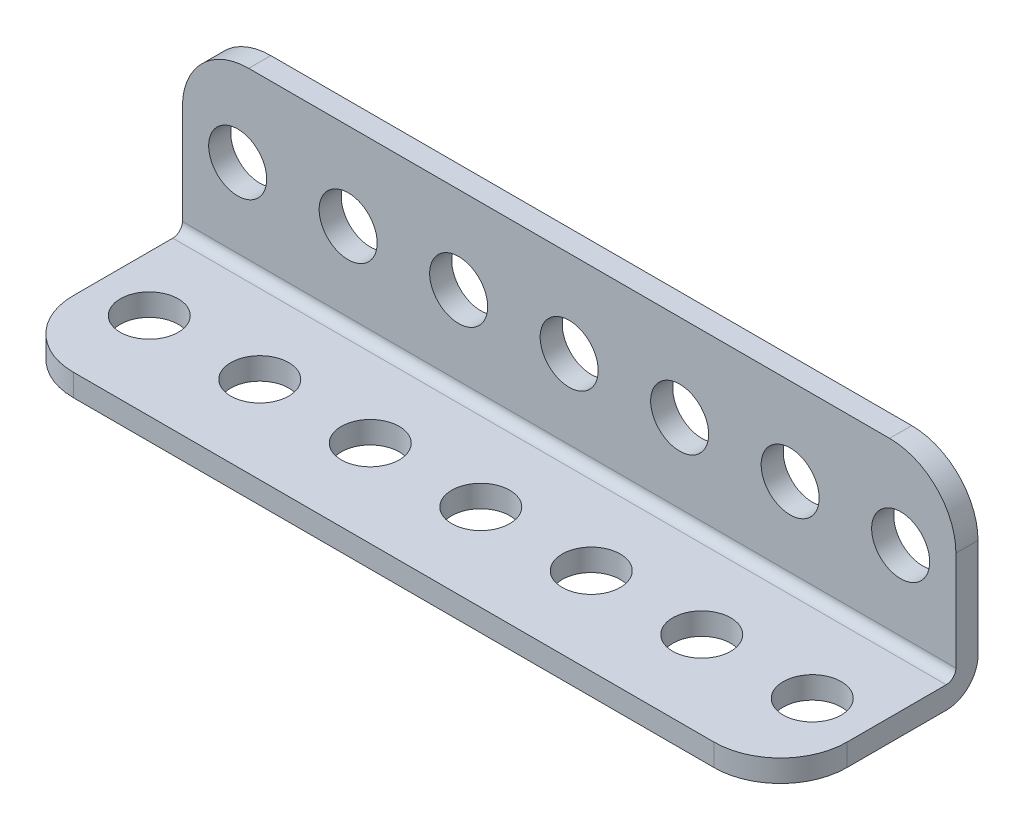
ISO-10303-21;
HEADER;
FILE_DESCRIPTION(('STEP AP214'),'2;1');
FILE_NAME('part.step','',(''),(''),'','','');
FILE_SCHEMA(('AUTOMOTIVE_DESIGN { 1 0 10303 214 1 1 1 1 }'));
ENDSEC;
DATA;
#1=APPLICATION_CONTEXT('core data for automotive mechanical design processes');
#2=APPLICATION_PROTOCOL_DEFINITION('international standard','automotive_design',2000,#1);
#3=PRODUCT_CONTEXT('',#1,'mechanical');
#4=PRODUCT('Part','Part','',(#3));
#5=PRODUCT_RELATED_PRODUCT_CATEGORY('part','',(#4));
#6=PRODUCT_DEFINITION_FORMATION('','',#4);
#7=PRODUCT_DEFINITION_CONTEXT('part definition',#1,'design');
#8=PRODUCT_DEFINITION('design','',#6,#7);
#9=PRODUCT_DEFINITION_SHAPE('','',#8);
#10=(LENGTH_UNIT() NAMED_UNIT(*) SI_UNIT(.MILLI.,.METRE.));
#11=(NAMED_UNIT(*) PLANE_ANGLE_UNIT() SI_UNIT($,.RADIAN.));
#12=(NAMED_UNIT(*) SI_UNIT($,.STERADIAN.) SOLID_ANGLE_UNIT());
#13=UNCERTAINTY_MEASURE_WITH_UNIT(LENGTH_MEASURE(1.E-05),#10,'distance_accuracy_value','');
#14=(GEOMETRIC_REPRESENTATION_CONTEXT(3) GLOBAL_UNCERTAINTY_ASSIGNED_CONTEXT((#13)) GLOBAL_UNIT_ASSIGNED_CONTEXT((#10,
#11,#12)) REPRESENTATION_CONTEXT('',''));
#15=CARTESIAN_POINT('',(0.,0.,0.));
#16=DIRECTION('',(0.,0.,1.));
#17=DIRECTION('',(1.,0.,0.));
#18=AXIS2_PLACEMENT_3D('',#15,#16,#17);
#19=CARTESIAN_POINT('',(51.2,7.9,-14.3));
#20=DIRECTION('',(0.,0.,1.));
#21=DIRECTION('',(0.,-1.,0.));
#22=AXIS2_PLACEMENT_3D('',#19,#20,#21);
#23=CYLINDRICAL_SURFACE('',#22,4.8);
#24=CARTESIAN_POINT('',(51.2,7.9,-14.3));
#25=DIRECTION('',(0.,0.,1.));
#26=DIRECTION('',(0.,-1.,0.));
#27=AXIS2_PLACEMENT_3D('',#24,#25,#26);
#28=CIRCLE('',#27,4.8);
#29=CARTESIAN_POINT('',(56.,7.9,-14.3));
#30=VERTEX_POINT('',#29);
#31=CARTESIAN_POINT('',(51.2,12.7,-14.3));
#32=VERTEX_POINT('',#31);
#33=EDGE_CURVE('E19',#30,#32,#28,.T.);
#34=ORIENTED_EDGE('',*,*,#33,.T.);
#35=DIRECTION('',(0.,0.,-1.));
#36=VECTOR('',#35,1.);
#37=CARTESIAN_POINT('',(51.2,12.7,-14.3));
#38=LINE('',#37,#36);
#39=CARTESIAN_POINT('',(51.2,12.7,-12.7));
#40=VERTEX_POINT('',#39);
#41=EDGE_CURVE('E109',#32,#40,#38,.F.);
#42=ORIENTED_EDGE('',*,*,#41,.T.);
#43=CARTESIAN_POINT('',(51.2,7.90000000000001,-12.7));
#44=DIRECTION('',(0.,0.,1.));
#45=DIRECTION('',(0.,-1.,0.));
#46=AXIS2_PLACEMENT_3D('',#43,#44,#45);
#47=CIRCLE('',#46,4.8);
#48=CARTESIAN_POINT('',(56.,7.90000000000001,-12.7));
#49=VERTEX_POINT('',#48);
#50=EDGE_CURVE('E105',#49,#40,#47,.T.);
#51=ORIENTED_EDGE('',*,*,#50,.F.);
#52=DIRECTION('',(0.,0.,1.));
#53=VECTOR('',#52,1.);
#54=CARTESIAN_POINT('',(56.,7.9,-14.3));
#55=LINE('',#54,#53);
#56=EDGE_CURVE('E102',#49,#30,#55,.F.);
#57=ORIENTED_EDGE('',*,*,#56,.T.);
#58=EDGE_LOOP('',(#34,#42,#51,#57));
#59=FACE_BOUND('',#58,.T.);
#60=ADVANCED_FACE('F16',(#59),#23,.T.);
#61=CARTESIAN_POINT('',(56.,12.7,-14.3));
#62=DIRECTION('',(0.,-1.,0.));
#63=DIRECTION('',(0.,0.,-1.));
#64=AXIS2_PLACEMENT_3D('',#61,#62,#63);
#65=PLANE('',#64);
#66=DIRECTION('',(1.,0.,0.));
#67=VECTOR('',#66,1.);
#68=CARTESIAN_POINT('',(0.,12.7,-12.7));
#69=LINE('',#68,#67);
#70=CARTESIAN_POINT('',(4.8,12.7,-12.7));
#71=VERTEX_POINT('',#70);
#72=EDGE_CURVE('E158',#40,#71,#69,.F.);
#73=ORIENTED_EDGE('',*,*,#72,.F.);
#74=ORIENTED_EDGE('',*,*,#41,.F.);
#75=DIRECTION('',(1.,0.,0.));
#76=VECTOR('',#75,1.);
#77=CARTESIAN_POINT('',(0.,12.7,-14.3));
#78=LINE('',#77,#76);
#79=CARTESIAN_POINT('',(4.8,12.7,-14.3));
#80=VERTEX_POINT('',#79);
#81=EDGE_CURVE('E118',#32,#80,#78,.F.);
#82=ORIENTED_EDGE('',*,*,#81,.T.);
#83=DIRECTION('',(0.,0.,1.));
#84=VECTOR('',#83,1.);
#85=CARTESIAN_POINT('',(4.8,12.7,-14.3));
#86=LINE('',#85,#84);
#87=EDGE_CURVE('E168',#71,#80,#86,.F.);
#88=ORIENTED_EDGE('',*,*,#87,.F.);
#89=EDGE_LOOP('',(#73,#74,#82,#88));
#90=FACE_BOUND('',#89,.T.);
#91=ADVANCED_FACE('F316',(#90),#65,.F.);
#92=CARTESIAN_POINT('',(4.8,7.9,-14.3));
#93=DIRECTION('',(0.,0.,1.));
#94=DIRECTION('',(0.,-1.,0.));
#95=AXIS2_PLACEMENT_3D('',#92,#93,#94);
#96=CYLINDRICAL_SURFACE('',#95,4.8);
#97=CARTESIAN_POINT('',(4.8,7.9,-14.3));
#98=DIRECTION('',(0.,0.,1.));
#99=DIRECTION('',(0.,-1.,0.));
#100=AXIS2_PLACEMENT_3D('',#97,#98,#99);
#101=CIRCLE('',#100,4.8);
#102=CARTESIAN_POINT('',(0.,7.9,-14.3));
#103=VERTEX_POINT('',#102);
#104=EDGE_CURVE('E162',#80,#103,#101,.T.);
#105=ORIENTED_EDGE('',*,*,#104,.T.);
#106=DIRECTION('',(0.,0.,1.));
#107=VECTOR('',#106,1.);
#108=CARTESIAN_POINT('',(0.,7.9,-14.3));
#109=LINE('',#108,#107);
#110=CARTESIAN_POINT('',(0.,7.90000000000001,-12.7));
#111=VERTEX_POINT('',#110);
#112=EDGE_CURVE('E164',#103,#111,#109,.T.);
#113=ORIENTED_EDGE('',*,*,#112,.T.);
#114=CARTESIAN_POINT('',(4.8,7.90000000000001,-12.7));
#115=DIRECTION('',(0.,0.,1.));
#116=DIRECTION('',(0.,-1.,0.));
#117=AXIS2_PLACEMENT_3D('',#114,#115,#116);
#118=CIRCLE('',#117,4.8);
#119=EDGE_CURVE('E160',#71,#111,#118,.T.);
#120=ORIENTED_EDGE('',*,*,#119,.F.);
#121=ORIENTED_EDGE('',*,*,#87,.T.);
#122=EDGE_LOOP('',(#105,#113,#120,#121));
#123=FACE_BOUND('',#122,.T.);
#124=ADVANCED_FACE('F270',(#123),#96,.T.);
#125=CARTESIAN_POINT('',(4.,6.4,-22.7));
#126=DIRECTION('',(0.,0.,1.));
#127=DIRECTION('',(1.,0.,0.));
#128=AXIS2_PLACEMENT_3D('',#125,#126,#127);
#129=CYLINDRICAL_SURFACE('',#128,2.1);
#130=CARTESIAN_POINT('',(4.,6.4,-14.3));
#131=DIRECTION('',(0.,0.,1.));
#132=DIRECTION('',(1.,0.,0.));
#133=AXIS2_PLACEMENT_3D('',#130,#131,#132);
#134=CIRCLE('',#133,2.1);
#135=CARTESIAN_POINT('',(6.1,6.4,-14.3));
#136=VERTEX_POINT('',#135);
#137=EDGE_CURVE('E265',#136,#136,#134,.F.);
#138=ORIENTED_EDGE('',*,*,#137,.T.);
#139=EDGE_LOOP('',(#138));
#140=FACE_BOUND('',#139,.T.);
#141=CARTESIAN_POINT('',(4.,6.4,-12.7));
#142=DIRECTION('',(0.,0.,1.));
#143=DIRECTION('',(1.,0.,0.));
#144=AXIS2_PLACEMENT_3D('',#141,#142,#143);
#145=CIRCLE('',#144,2.1);
#146=CARTESIAN_POINT('',(6.1,6.4,-12.7));
#147=VERTEX_POINT('',#146);
#148=EDGE_CURVE('E241',#147,#147,#145,.F.);
#149=ORIENTED_EDGE('',*,*,#148,.F.);
#150=EDGE_LOOP('',(#149));
#151=FACE_BOUND('',#150,.T.);
#152=ADVANCED_FACE('F323',(#140,#151),#129,.F.);
#153=CARTESIAN_POINT('',(12.,6.4,-22.7));
#154=DIRECTION('',(0.,0.,1.));
#155=DIRECTION('',(1.,0.,0.));
#156=AXIS2_PLACEMENT_3D('',#153,#154,#155);
#157=CYLINDRICAL_SURFACE('',#156,2.1);
#158=CARTESIAN_POINT('',(12.,6.4,-14.3));
#159=DIRECTION('',(0.,0.,1.));
#160=DIRECTION('',(1.,0.,0.));
#161=AXIS2_PLACEMENT_3D('',#158,#159,#160);
#162=CIRCLE('',#161,2.1);
#163=CARTESIAN_POINT('',(14.1,6.4,-14.3));
#164=VERTEX_POINT('',#163);
#165=EDGE_CURVE('E262',#164,#164,#162,.F.);
#166=ORIENTED_EDGE('',*,*,#165,.T.);
#167=EDGE_LOOP('',(#166));
#168=FACE_BOUND('',#167,.T.);
#169=CARTESIAN_POINT('',(12.,6.4,-12.7));
#170=DIRECTION('',(0.,0.,1.));
#171=DIRECTION('',(1.,0.,0.));
#172=AXIS2_PLACEMENT_3D('',#169,#170,#171);
#173=CIRCLE('',#172,2.1);
#174=CARTESIAN_POINT('',(14.1,6.4,-12.7));
#175=VERTEX_POINT('',#174);
#176=EDGE_CURVE('E238',#175,#175,#173,.F.);
#177=ORIENTED_EDGE('',*,*,#176,.F.);
#178=EDGE_LOOP('',(#177));
#179=FACE_BOUND('',#178,.T.);
#180=ADVANCED_FACE('F405',(#168,#179),#157,.F.);
#181=CARTESIAN_POINT('',(52.,6.4,-22.7));
#182=DIRECTION('',(0.,0.,1.));
#183=DIRECTION('',(1.,0.,0.));
#184=AXIS2_PLACEMENT_3D('',#181,#182,#183);
#185=CYLINDRICAL_SURFACE('',#184,2.1);
#186=CARTESIAN_POINT('',(52.,6.4,-14.3));
#187=DIRECTION('',(0.,0.,1.));
#188=DIRECTION('',(1.,0.,0.));
#189=AXIS2_PLACEMENT_3D('',#186,#187,#188);
#190=CIRCLE('',#189,2.1);
#191=CARTESIAN_POINT('',(54.1,6.4,-14.3));
#192=VERTEX_POINT('',#191);
#193=EDGE_CURVE('E259',#192,#192,#190,.F.);
#194=ORIENTED_EDGE('',*,*,#193,.T.);
#195=EDGE_LOOP('',(#194));
#196=FACE_BOUND('',#195,.T.);
#197=CARTESIAN_POINT('',(52.,6.4,-12.7));
#198=DIRECTION('',(0.,0.,1.));
#199=DIRECTION('',(1.,0.,0.));
#200=AXIS2_PLACEMENT_3D('',#197,#198,#199);
#201=CIRCLE('',#200,2.1);
#202=CARTESIAN_POINT('',(54.1,6.4,-12.7));
#203=VERTEX_POINT('',#202);
#204=EDGE_CURVE('E235',#203,#203,#201,.F.);
#205=ORIENTED_EDGE('',*,*,#204,.F.);
#206=EDGE_LOOP('',(#205));
#207=FACE_BOUND('',#206,.T.);
#208=ADVANCED_FACE('F401',(#196,#207),#185,.F.);
#209=CARTESIAN_POINT('',(44.,6.4,-22.7));
#210=DIRECTION('',(0.,0.,1.));
#211=DIRECTION('',(1.,0.,0.));
#212=AXIS2_PLACEMENT_3D('',#209,#210,#211);
#213=CYLINDRICAL_SURFACE('',#212,2.1);
#214=CARTESIAN_POINT('',(44.,6.4,-14.3));
#215=DIRECTION('',(0.,0.,1.));
#216=DIRECTION('',(1.,0.,0.));
#217=AXIS2_PLACEMENT_3D('',#214,#215,#216);
#218=CIRCLE('',#217,2.1);
#219=CARTESIAN_POINT('',(46.1,6.4,-14.3));
#220=VERTEX_POINT('',#219);
#221=EDGE_CURVE('E256',#220,#220,#218,.F.);
#222=ORIENTED_EDGE('',*,*,#221,.T.);
#223=EDGE_LOOP('',(#222));
#224=FACE_BOUND('',#223,.T.);
#225=CARTESIAN_POINT('',(44.,6.4,-12.7));
#226=DIRECTION('',(0.,0.,1.));
#227=DIRECTION('',(1.,0.,0.));
#228=AXIS2_PLACEMENT_3D('',#225,#226,#227);
#229=CIRCLE('',#228,2.1);
#230=CARTESIAN_POINT('',(46.1,6.4,-12.7));
#231=VERTEX_POINT('',#230);
#232=EDGE_CURVE('E232',#231,#231,#229,.F.);
#233=ORIENTED_EDGE('',*,*,#232,.F.);
#234=EDGE_LOOP('',(#233));
#235=FACE_BOUND('',#234,.T.);
#236=ADVANCED_FACE('F397',(#224,#235),#213,.F.);
#237=CARTESIAN_POINT('',(36.,6.4,-22.7));
#238=DIRECTION('',(0.,0.,1.));
#239=DIRECTION('',(1.,0.,0.));
#240=AXIS2_PLACEMENT_3D('',#237,#238,#239);
#241=CYLINDRICAL_SURFACE('',#240,2.1);
#242=CARTESIAN_POINT('',(36.,6.4,-14.3));
#243=DIRECTION('',(0.,0.,1.));
#244=DIRECTION('',(1.,0.,0.));
#245=AXIS2_PLACEMENT_3D('',#242,#243,#244);
#246=CIRCLE('',#245,2.1);
#247=CARTESIAN_POINT('',(38.1,6.4,-14.3));
#248=VERTEX_POINT('',#247);
#249=EDGE_CURVE('E253',#248,#248,#246,.F.);
#250=ORIENTED_EDGE('',*,*,#249,.T.);
#251=EDGE_LOOP('',(#250));
#252=FACE_BOUND('',#251,.T.);
#253=CARTESIAN_POINT('',(36.,6.4,-12.7));
#254=DIRECTION('',(0.,0.,1.));
#255=DIRECTION('',(1.,0.,0.));
#256=AXIS2_PLACEMENT_3D('',#253,#254,#255);
#257=CIRCLE('',#256,2.1);
#258=CARTESIAN_POINT('',(38.1,6.4,-12.7));
#259=VERTEX_POINT('',#258);
#260=EDGE_CURVE('E229',#259,#259,#257,.F.);
#261=ORIENTED_EDGE('',*,*,#260,.F.);
#262=EDGE_LOOP('',(#261));
#263=FACE_BOUND('',#262,.T.);
#264=ADVANCED_FACE('F393',(#252,#263),#241,.F.);
#265=CARTESIAN_POINT('',(28.,6.4,-22.7));
#266=DIRECTION('',(0.,0.,1.));
#267=DIRECTION('',(1.,0.,0.));
#268=AXIS2_PLACEMENT_3D('',#265,#266,#267);
#269=CYLINDRICAL_SURFACE('',#268,2.1);
#270=CARTESIAN_POINT('',(28.,6.4,-14.3));
#271=DIRECTION('',(0.,0.,1.));
#272=DIRECTION('',(1.,0.,0.));
#273=AXIS2_PLACEMENT_3D('',#270,#271,#272);
#274=CIRCLE('',#273,2.1);
#275=CARTESIAN_POINT('',(30.1,6.4,-14.3));
#276=VERTEX_POINT('',#275);
#277=EDGE_CURVE('E250',#276,#276,#274,.F.);
#278=ORIENTED_EDGE('',*,*,#277,.T.);
#279=EDGE_LOOP('',(#278));
#280=FACE_BOUND('',#279,.T.);
#281=CARTESIAN_POINT('',(28.,6.4,-12.7));
#282=DIRECTION('',(0.,0.,1.));
#283=DIRECTION('',(1.,0.,0.));
#284=AXIS2_PLACEMENT_3D('',#281,#282,#283);
#285=CIRCLE('',#284,2.1);
#286=CARTESIAN_POINT('',(30.1,6.4,-12.7));
#287=VERTEX_POINT('',#286);
#288=EDGE_CURVE('E226',#287,#287,#285,.F.);
#289=ORIENTED_EDGE('',*,*,#288,.F.);
#290=EDGE_LOOP('',(#289));
#291=FACE_BOUND('',#290,.T.);
#292=ADVANCED_FACE('F389',(#280,#291),#269,.F.);
#293=CARTESIAN_POINT('',(20.,6.4,-22.7));
#294=DIRECTION('',(0.,0.,1.));
#295=DIRECTION('',(1.,0.,0.));
#296=AXIS2_PLACEMENT_3D('',#293,#294,#295);
#297=CYLINDRICAL_SURFACE('',#296,2.1);
#298=CARTESIAN_POINT('',(20.,6.4,-14.3));
#299=DIRECTION('',(0.,0.,1.));
#300=DIRECTION('',(1.,0.,0.));
#301=AXIS2_PLACEMENT_3D('',#298,#299,#300);
#302=CIRCLE('',#301,2.1);
#303=CARTESIAN_POINT('',(22.1,6.4,-14.3));
#304=VERTEX_POINT('',#303);
#305=EDGE_CURVE('E247',#304,#304,#302,.F.);
#306=ORIENTED_EDGE('',*,*,#305,.T.);
#307=EDGE_LOOP('',(#306));
#308=FACE_BOUND('',#307,.T.);
#309=CARTESIAN_POINT('',(20.,6.4,-12.7));
#310=DIRECTION('',(0.,0.,1.));
#311=DIRECTION('',(1.,0.,0.));
#312=AXIS2_PLACEMENT_3D('',#309,#310,#311);
#313=CIRCLE('',#312,2.1);
#314=CARTESIAN_POINT('',(22.1,6.4,-12.7));
#315=VERTEX_POINT('',#314);
#316=EDGE_CURVE('E166',#315,#315,#313,.F.);
#317=ORIENTED_EDGE('',*,*,#316,.F.);
#318=EDGE_LOOP('',(#317));
#319=FACE_BOUND('',#318,.T.);
#320=ADVANCED_FACE('F386',(#308,#319),#297,.F.);
#321=CARTESIAN_POINT('',(0.,0.699999999999995,-12.));
#322=DIRECTION('',(-1.,0.,0.));
#323=DIRECTION('',(0.,0.,1.));
#324=AXIS2_PLACEMENT_3D('',#321,#322,#323);
#325=CYLINDRICAL_SURFACE('',#324,2.3);
#326=DIRECTION('',(1.,0.,0.));
#327=VECTOR('',#326,1.);
#328=CARTESIAN_POINT('',(0.,-1.6,-12.));
#329=LINE('',#328,#327);
#330=CARTESIAN_POINT('',(0.,-1.6,-12.));
#331=VERTEX_POINT('',#330);
#332=CARTESIAN_POINT('',(56.,-1.6,-12.));
#333=VERTEX_POINT('',#332);
#334=EDGE_CURVE('E151',#331,#333,#329,.T.);
#335=ORIENTED_EDGE('',*,*,#334,.F.);
#336=CARTESIAN_POINT('',(0.,0.699999999999995,-12.));
#337=DIRECTION('',(-1.,0.,0.));
#338=DIRECTION('',(0.,0.,1.));
#339=AXIS2_PLACEMENT_3D('',#336,#337,#338);
#340=CIRCLE('',#339,2.3);
#341=CARTESIAN_POINT('',(0.,0.699999999999998,-14.3));
#342=VERTEX_POINT('',#341);
#343=EDGE_CURVE('E144',#342,#331,#340,.T.);
#344=ORIENTED_EDGE('',*,*,#343,.F.);
#345=DIRECTION('',(1.,0.,0.));
#346=VECTOR('',#345,1.);
#347=CARTESIAN_POINT('',(0.,0.700000000000002,-14.3));
#348=LINE('',#347,#346);
#349=CARTESIAN_POINT('',(56.,0.699999999999998,-14.3));
#350=VERTEX_POINT('',#349);
#351=EDGE_CURVE('E119',#342,#350,#348,.T.);
#352=ORIENTED_EDGE('',*,*,#351,.T.);
#353=CARTESIAN_POINT('',(56.,0.699999999999995,-12.));
#354=DIRECTION('',(-1.,0.,0.));
#355=DIRECTION('',(0.,0.,1.));
#356=AXIS2_PLACEMENT_3D('',#353,#354,#355);
#357=CIRCLE('',#356,2.3);
#358=EDGE_CURVE('E124',#333,#350,#357,.F.);
#359=ORIENTED_EDGE('',*,*,#358,.F.);
#360=EDGE_LOOP('',(#335,#344,#352,#359));
#361=FACE_BOUND('',#360,.T.);
#362=ADVANCED_FACE('F278',(#361),#325,.T.);
#363=CARTESIAN_POINT('',(0.,0.,-14.3));
#364=DIRECTION('',(0.,0.,1.));
#365=DIRECTION('',(0.,-1.,0.));
#366=AXIS2_PLACEMENT_3D('',#363,#364,#365);
#367=PLANE('',#366);
#368=ORIENTED_EDGE('',*,*,#305,.F.);
#369=EDGE_LOOP('',(#368));
#370=FACE_BOUND('',#369,.T.);
#371=ORIENTED_EDGE('',*,*,#277,.F.);
#372=EDGE_LOOP('',(#371));
#373=FACE_BOUND('',#372,.T.);
#374=ORIENTED_EDGE('',*,*,#249,.F.);
#375=EDGE_LOOP('',(#374));
#376=FACE_BOUND('',#375,.T.);
#377=ORIENTED_EDGE('',*,*,#221,.F.);
#378=EDGE_LOOP('',(#377));
#379=FACE_BOUND('',#378,.T.);
#380=ORIENTED_EDGE('',*,*,#193,.F.);
#381=EDGE_LOOP('',(#380));
#382=FACE_BOUND('',#381,.T.);
#383=ORIENTED_EDGE('',*,*,#165,.F.);
#384=EDGE_LOOP('',(#383));
#385=FACE_BOUND('',#384,.T.);
#386=ORIENTED_EDGE('',*,*,#137,.F.);
#387=EDGE_LOOP('',(#386));
#388=FACE_BOUND('',#387,.T.);
#389=ORIENTED_EDGE('',*,*,#81,.F.);
#390=ORIENTED_EDGE('',*,*,#33,.F.);
#391=DIRECTION('',(0.,1.,0.));
#392=VECTOR('',#391,1.);
#393=CARTESIAN_POINT('',(56.,-1.6,-14.3));
#394=LINE('',#393,#392);
#395=EDGE_CURVE('E115',#350,#30,#394,.T.);
#396=ORIENTED_EDGE('',*,*,#395,.F.);
#397=ORIENTED_EDGE('',*,*,#351,.F.);
#398=DIRECTION('',(0.,1.,0.));
#399=VECTOR('',#398,1.);
#400=CARTESIAN_POINT('',(0.,-1.6,-14.3));
#401=LINE('',#400,#399);
#402=EDGE_CURVE('E145',#103,#342,#401,.F.);
#403=ORIENTED_EDGE('',*,*,#402,.F.);
#404=ORIENTED_EDGE('',*,*,#104,.F.);
#405=EDGE_LOOP('',(#389,#390,#396,#397,#403,#404));
#406=FACE_BOUND('',#405,.T.);
#407=ADVANCED_FACE('F114',(#370,#373,#376,#379,#382,#385,#388,#406),#367,.F.);
#408=CARTESIAN_POINT('',(0.,0.,-12.7));
#409=DIRECTION('',(0.,0.,1.));
#410=DIRECTION('',(0.,-1.,0.));
#411=AXIS2_PLACEMENT_3D('',#408,#409,#410);
#412=PLANE('',#411);
#413=ORIENTED_EDGE('',*,*,#316,.T.);
#414=EDGE_LOOP('',(#413));
#415=FACE_BOUND('',#414,.T.);
#416=ORIENTED_EDGE('',*,*,#288,.T.);
#417=EDGE_LOOP('',(#416));
#418=FACE_BOUND('',#417,.T.);
#419=ORIENTED_EDGE('',*,*,#260,.T.);
#420=EDGE_LOOP('',(#419));
#421=FACE_BOUND('',#420,.T.);
#422=ORIENTED_EDGE('',*,*,#232,.T.);
#423=EDGE_LOOP('',(#422));
#424=FACE_BOUND('',#423,.T.);
#425=ORIENTED_EDGE('',*,*,#204,.T.);
#426=EDGE_LOOP('',(#425));
#427=FACE_BOUND('',#426,.T.);
#428=ORIENTED_EDGE('',*,*,#176,.T.);
#429=EDGE_LOOP('',(#428));
#430=FACE_BOUND('',#429,.T.);
#431=ORIENTED_EDGE('',*,*,#148,.T.);
#432=EDGE_LOOP('',(#431));
#433=FACE_BOUND('',#432,.T.);
#434=DIRECTION('',(0.,1.,0.));
#435=VECTOR('',#434,1.);
#436=CARTESIAN_POINT('',(0.,-1.6,-12.7));
#437=LINE('',#436,#435);
#438=CARTESIAN_POINT('',(0.,0.699999999999993,-12.7));
#439=VERTEX_POINT('',#438);
#440=EDGE_CURVE('E148',#439,#111,#437,.T.);
#441=ORIENTED_EDGE('',*,*,#440,.F.);
#442=DIRECTION('',(-1.,0.,0.));
#443=VECTOR('',#442,1.);
#444=CARTESIAN_POINT('',(0.,0.699999999999992,-12.7));
#445=LINE('',#444,#443);
#446=CARTESIAN_POINT('',(56.,0.699999999999993,-12.7));
#447=VERTEX_POINT('',#446);
#448=EDGE_CURVE('E135',#439,#447,#445,.F.);
#449=ORIENTED_EDGE('',*,*,#448,.T.);
#450=DIRECTION('',(0.,1.,0.));
#451=VECTOR('',#450,1.);
#452=CARTESIAN_POINT('',(56.,-1.6,-12.7));
#453=LINE('',#452,#451);
#454=EDGE_CURVE('E126',#49,#447,#453,.F.);
#455=ORIENTED_EDGE('',*,*,#454,.F.);
#456=ORIENTED_EDGE('',*,*,#50,.T.);
#457=ORIENTED_EDGE('',*,*,#72,.T.);
#458=ORIENTED_EDGE('',*,*,#119,.T.);
#459=EDGE_LOOP('',(#441,#449,#455,#456,#457,#458));
#460=FACE_BOUND('',#459,.T.);
#461=ADVANCED_FACE('F312',(#415,#418,#421,#424,#427,#430,#433,#460),#412,.T.);
#462=CARTESIAN_POINT('',(0.,-1.6,0.));
#463=DIRECTION('',(0.,-1.,0.));
#464=DIRECTION('',(0.,0.,-1.));
#465=AXIS2_PLACEMENT_3D('',#462,#463,#464);
#466=PLANE('',#465);
#467=CARTESIAN_POINT('',(20.,-1.6,-6.30000000000005));
#468=DIRECTION('',(0.,1.,0.));
#469=DIRECTION('',(0.,0.,1.));
#470=AXIS2_PLACEMENT_3D('',#467,#468,#469);
#471=CIRCLE('',#470,2.1);
#472=CARTESIAN_POINT('',(20.,-1.6,-4.20000000000005));
#473=VERTEX_POINT('',#472);
#474=EDGE_CURVE('E194',#473,#473,#471,.T.);
#475=ORIENTED_EDGE('',*,*,#474,.T.);
#476=EDGE_LOOP('',(#475));
#477=FACE_BOUND('',#476,.T.);
#478=CARTESIAN_POINT('',(28.,-1.6,-6.30000000000005));
#479=DIRECTION('',(0.,1.,0.));
#480=DIRECTION('',(0.,0.,1.));
#481=AXIS2_PLACEMENT_3D('',#478,#479,#480);
#482=CIRCLE('',#481,2.1);
#483=CARTESIAN_POINT('',(28.,-1.6,-4.20000000000005));
#484=VERTEX_POINT('',#483);
#485=EDGE_CURVE('E197',#484,#484,#482,.T.);
#486=ORIENTED_EDGE('',*,*,#485,.T.);
#487=EDGE_LOOP('',(#486));
#488=FACE_BOUND('',#487,.T.);
#489=CARTESIAN_POINT('',(36.,-1.6,-6.30000000000005));
#490=DIRECTION('',(0.,1.,0.));
#491=DIRECTION('',(0.,0.,1.));
#492=AXIS2_PLACEMENT_3D('',#489,#490,#491);
#493=CIRCLE('',#492,2.1);
#494=CARTESIAN_POINT('',(36.,-1.6,-4.20000000000005));
#495=VERTEX_POINT('',#494);
#496=EDGE_CURVE('E200',#495,#495,#493,.T.);
#497=ORIENTED_EDGE('',*,*,#496,.T.);
#498=EDGE_LOOP('',(#497));
#499=FACE_BOUND('',#498,.T.);
#500=CARTESIAN_POINT('',(44.,-1.6,-6.30000000000005));
#501=DIRECTION('',(0.,1.,0.));
#502=DIRECTION('',(0.,0.,1.));
#503=AXIS2_PLACEMENT_3D('',#500,#501,#502);
#504=CIRCLE('',#503,2.1);
#505=CARTESIAN_POINT('',(44.,-1.6,-4.20000000000005));
#506=VERTEX_POINT('',#505);
#507=EDGE_CURVE('E203',#506,#506,#504,.T.);
#508=ORIENTED_EDGE('',*,*,#507,.T.);
#509=EDGE_LOOP('',(#508));
#510=FACE_BOUND('',#509,.T.);
#511=CARTESIAN_POINT('',(52.,-1.6,-6.30000000000005));
#512=DIRECTION('',(0.,1.,0.));
#513=DIRECTION('',(0.,0.,1.));
#514=AXIS2_PLACEMENT_3D('',#511,#512,#513);
#515=CIRCLE('',#514,2.1);
#516=CARTESIAN_POINT('',(52.,-1.6,-4.20000000000005));
#517=VERTEX_POINT('',#516);
#518=EDGE_CURVE('E206',#517,#517,#515,.T.);
#519=ORIENTED_EDGE('',*,*,#518,.T.);
#520=EDGE_LOOP('',(#519));
#521=FACE_BOUND('',#520,.T.);
#522=CARTESIAN_POINT('',(12.,-1.6,-6.30000000000005));
#523=DIRECTION('',(0.,1.,0.));
#524=DIRECTION('',(0.,0.,1.));
#525=AXIS2_PLACEMENT_3D('',#522,#523,#524);
#526=CIRCLE('',#525,2.1);
#527=CARTESIAN_POINT('',(12.,-1.6,-4.20000000000005));
#528=VERTEX_POINT('',#527);
#529=EDGE_CURVE('E209',#528,#528,#526,.T.);
#530=ORIENTED_EDGE('',*,*,#529,.T.);
#531=EDGE_LOOP('',(#530));
#532=FACE_BOUND('',#531,.T.);
#533=CARTESIAN_POINT('',(4.,-1.6,-6.30000000000005));
#534=DIRECTION('',(0.,1.,0.));
#535=DIRECTION('',(0.,0.,1.));
#536=AXIS2_PLACEMENT_3D('',#533,#534,#535);
#537=CIRCLE('',#536,2.1);
#538=CARTESIAN_POINT('',(4.,-1.6,-4.20000000000005));
#539=VERTEX_POINT('',#538);
#540=EDGE_CURVE('E212',#539,#539,#537,.T.);
#541=ORIENTED_EDGE('',*,*,#540,.T.);
#542=EDGE_LOOP('',(#541));
#543=FACE_BOUND('',#542,.T.);
#544=DIRECTION('',(0.,0.,1.));
#545=VECTOR('',#544,1.);
#546=CARTESIAN_POINT('',(0.,-1.6,0.));
#547=LINE('',#546,#545);
#548=CARTESIAN_POINT('',(0.,-1.6,-4.8));
#549=VERTEX_POINT('',#548);
#550=EDGE_CURVE('E141',#331,#549,#547,.T.);
#551=ORIENTED_EDGE('',*,*,#550,.F.);
#552=ORIENTED_EDGE('',*,*,#334,.T.);
#553=DIRECTION('',(0.,0.,-1.));
#554=VECTOR('',#553,1.);
#555=CARTESIAN_POINT('',(56.,-1.6,0.));
#556=LINE('',#555,#554);
#557=CARTESIAN_POINT('',(56.,-1.6,-4.8));
#558=VERTEX_POINT('',#557);
#559=EDGE_CURVE('E130',#558,#333,#556,.T.);
#560=ORIENTED_EDGE('',*,*,#559,.F.);
#561=CARTESIAN_POINT('',(51.2,-1.6,-4.8));
#562=DIRECTION('',(0.,1.,0.));
#563=DIRECTION('',(0.,0.,1.));
#564=AXIS2_PLACEMENT_3D('',#561,#562,#563);
#565=CIRCLE('',#564,4.8);
#566=CARTESIAN_POINT('',(51.2,-1.6,0.));
#567=VERTEX_POINT('',#566);
#568=EDGE_CURVE('E218',#567,#558,#565,.T.);
#569=ORIENTED_EDGE('',*,*,#568,.F.);
#570=DIRECTION('',(1.,0.,0.));
#571=VECTOR('',#570,1.);
#572=CARTESIAN_POINT('',(0.,-1.6,0.));
#573=LINE('',#572,#571);
#574=CARTESIAN_POINT('',(4.8,-1.6,0.));
#575=VERTEX_POINT('',#574);
#576=EDGE_CURVE('E152',#575,#567,#573,.T.);
#577=ORIENTED_EDGE('',*,*,#576,.F.);
#578=CARTESIAN_POINT('',(4.8,-1.6,-4.8));
#579=DIRECTION('',(0.,1.,0.));
#580=DIRECTION('',(0.,0.,1.));
#581=AXIS2_PLACEMENT_3D('',#578,#579,#580);
#582=CIRCLE('',#581,4.8);
#583=EDGE_CURVE('E215',#549,#575,#582,.T.);
#584=ORIENTED_EDGE('',*,*,#583,.F.);
#585=EDGE_LOOP('',(#551,#552,#560,#569,#577,#584));
#586=FACE_BOUND('',#585,.T.);
#587=ADVANCED_FACE('F283',(#477,#488,#499,#510,#521,#532,#543,#586),#466,.T.);
#588=CARTESIAN_POINT('',(0.,-1.6,0.));
#589=DIRECTION('',(-1.,0.,0.));
#590=DIRECTION('',(0.,0.,1.));
#591=AXIS2_PLACEMENT_3D('',#588,#589,#590);
#592=PLANE('',#591);
#593=ORIENTED_EDGE('',*,*,#550,.T.);
#594=DIRECTION('',(0.,1.,0.));
#595=VECTOR('',#594,1.);
#596=CARTESIAN_POINT('',(0.,-1.6,-4.8));
#597=LINE('',#596,#595);
#598=CARTESIAN_POINT('',(0.,0.,-4.8));
#599=VERTEX_POINT('',#598);
#600=EDGE_CURVE('E217',#599,#549,#597,.F.);
#601=ORIENTED_EDGE('',*,*,#600,.F.);
#602=DIRECTION('',(0.,0.,-1.));
#603=VECTOR('',#602,1.);
#604=CARTESIAN_POINT('',(0.,0.,0.));
#605=LINE('',#604,#603);
#606=CARTESIAN_POINT('',(0.,0.,-12.));
#607=VERTEX_POINT('',#606);
#608=EDGE_CURVE('E140',#599,#607,#605,.T.);
#609=ORIENTED_EDGE('',*,*,#608,.T.);
#610=CARTESIAN_POINT('',(0.,0.699999999999995,-12.));
#611=DIRECTION('',(-1.,0.,0.));
#612=DIRECTION('',(0.,0.,1.));
#613=AXIS2_PLACEMENT_3D('',#610,#611,#612);
#614=CIRCLE('',#613,0.700000000000001);
#615=EDGE_CURVE('E143',#607,#439,#614,.F.);
#616=ORIENTED_EDGE('',*,*,#615,.T.);
#617=ORIENTED_EDGE('',*,*,#440,.T.);
#618=ORIENTED_EDGE('',*,*,#112,.F.);
#619=ORIENTED_EDGE('',*,*,#402,.T.);
#620=ORIENTED_EDGE('',*,*,#343,.T.);
#621=EDGE_LOOP('',(#593,#601,#609,#616,#617,#618,#619,#620));
#622=FACE_BOUND('',#621,.T.);
#623=ADVANCED_FACE('F275',(#622),#592,.T.);
#624=CARTESIAN_POINT('',(0.,0.699999999999995,-12.));
#625=DIRECTION('',(-1.,0.,0.));
#626=DIRECTION('',(0.,0.,1.));
#627=AXIS2_PLACEMENT_3D('',#624,#625,#626);
#628=CYLINDRICAL_SURFACE('',#627,0.700000000000001);
#629=ORIENTED_EDGE('',*,*,#448,.F.);
#630=ORIENTED_EDGE('',*,*,#615,.F.);
#631=DIRECTION('',(1.,0.,0.));
#632=VECTOR('',#631,1.);
#633=CARTESIAN_POINT('',(0.,0.,-12.));
#634=LINE('',#633,#632);
#635=CARTESIAN_POINT('',(56.,0.,-12.));
#636=VERTEX_POINT('',#635);
#637=EDGE_CURVE('E136',#607,#636,#634,.T.);
#638=ORIENTED_EDGE('',*,*,#637,.T.);
#639=CARTESIAN_POINT('',(56.,0.699999999999995,-12.));
#640=DIRECTION('',(-1.,0.,0.));
#641=DIRECTION('',(0.,0.,1.));
#642=AXIS2_PLACEMENT_3D('',#639,#640,#641);
#643=CIRCLE('',#642,0.700000000000001);
#644=EDGE_CURVE('E128',#447,#636,#643,.T.);
#645=ORIENTED_EDGE('',*,*,#644,.F.);
#646=EDGE_LOOP('',(#629,#630,#638,#645));
#647=FACE_BOUND('',#646,.T.);
#648=ADVANCED_FACE('F310',(#647),#628,.F.);
#649=CARTESIAN_POINT('',(56.,-1.6,0.));
#650=DIRECTION('',(1.,0.,0.));
#651=DIRECTION('',(0.,0.,-1.));
#652=AXIS2_PLACEMENT_3D('',#649,#650,#651);
#653=PLANE('',#652);
#654=DIRECTION('',(0.,0.,-1.));
#655=VECTOR('',#654,1.);
#656=CARTESIAN_POINT('',(56.,0.,0.));
#657=LINE('',#656,#655);
#658=CARTESIAN_POINT('',(56.,0.,-4.8));
#659=VERTEX_POINT('',#658);
#660=EDGE_CURVE('E139',#636,#659,#657,.F.);
#661=ORIENTED_EDGE('',*,*,#660,.T.);
#662=DIRECTION('',(0.,1.,0.));
#663=VECTOR('',#662,1.);
#664=CARTESIAN_POINT('',(56.,-1.6,-4.8));
#665=LINE('',#664,#663);
#666=EDGE_CURVE('E155',#558,#659,#665,.T.);
#667=ORIENTED_EDGE('',*,*,#666,.F.);
#668=ORIENTED_EDGE('',*,*,#559,.T.);
#669=ORIENTED_EDGE('',*,*,#358,.T.);
#670=ORIENTED_EDGE('',*,*,#395,.T.);
#671=ORIENTED_EDGE('',*,*,#56,.F.);
#672=ORIENTED_EDGE('',*,*,#454,.T.);
#673=ORIENTED_EDGE('',*,*,#644,.T.);
#674=EDGE_LOOP('',(#661,#667,#668,#669,#670,#671,#672,#673));
#675=FACE_BOUND('',#674,.T.);
#676=ADVANCED_FACE('F121',(#675),#653,.T.);
#677=CARTESIAN_POINT('',(51.2,-1.6,-4.8));
#678=DIRECTION('',(0.,1.,0.));
#679=DIRECTION('',(0.,0.,1.));
#680=AXIS2_PLACEMENT_3D('',#677,#678,#679);
#681=CYLINDRICAL_SURFACE('',#680,4.8);
#682=ORIENTED_EDGE('',*,*,#568,.T.);
#683=ORIENTED_EDGE('',*,*,#666,.T.);
#684=CARTESIAN_POINT('',(51.2,0.,-4.8));
#685=DIRECTION('',(0.,1.,0.));
#686=DIRECTION('',(0.,0.,1.));
#687=AXIS2_PLACEMENT_3D('',#684,#685,#686);
#688=CIRCLE('',#687,4.8);
#689=CARTESIAN_POINT('',(51.2,0.,0.));
#690=VERTEX_POINT('',#689);
#691=EDGE_CURVE('E191',#659,#690,#688,.F.);
#692=ORIENTED_EDGE('',*,*,#691,.T.);
#693=DIRECTION('',(0.,1.,0.));
#694=VECTOR('',#693,1.);
#695=CARTESIAN_POINT('',(51.2,-1.6,0.));
#696=LINE('',#695,#694);
#697=EDGE_CURVE('E154',#567,#690,#696,.T.);
#698=ORIENTED_EDGE('',*,*,#697,.F.);
#699=EDGE_LOOP('',(#682,#683,#692,#698));
#700=FACE_BOUND('',#699,.T.);
#701=ADVANCED_FACE('F296',(#700),#681,.T.);
#702=CARTESIAN_POINT('',(0.,-1.6,0.));
#703=DIRECTION('',(0.,0.,1.));
#704=DIRECTION('',(1.,0.,0.));
#705=AXIS2_PLACEMENT_3D('',#702,#703,#704);
#706=PLANE('',#705);
#707=DIRECTION('',(1.,0.,0.));
#708=VECTOR('',#707,1.);
#709=CARTESIAN_POINT('',(0.,0.,0.));
#710=LINE('',#709,#708);
#711=CARTESIAN_POINT('',(4.8,0.,0.));
#712=VERTEX_POINT('',#711);
#713=EDGE_CURVE('E190',#690,#712,#710,.F.);
#714=ORIENTED_EDGE('',*,*,#713,.T.);
#715=DIRECTION('',(0.,1.,0.));
#716=VECTOR('',#715,1.);
#717=CARTESIAN_POINT('',(4.8,-1.6,0.));
#718=LINE('',#717,#716);
#719=EDGE_CURVE('E34',#575,#712,#718,.T.);
#720=ORIENTED_EDGE('',*,*,#719,.F.);
#721=ORIENTED_EDGE('',*,*,#576,.T.);
#722=ORIENTED_EDGE('',*,*,#697,.T.);
#723=EDGE_LOOP('',(#714,#720,#721,#722));
#724=FACE_BOUND('',#723,.T.);
#725=ADVANCED_FACE('F363',(#724),#706,.T.);
#726=CARTESIAN_POINT('',(4.8,-1.6,-4.8));
#727=DIRECTION('',(0.,1.,0.));
#728=DIRECTION('',(0.,0.,1.));
#729=AXIS2_PLACEMENT_3D('',#726,#727,#728);
#730=CYLINDRICAL_SURFACE('',#729,4.8);
#731=ORIENTED_EDGE('',*,*,#583,.T.);
#732=ORIENTED_EDGE('',*,*,#719,.T.);
#733=CARTESIAN_POINT('',(4.8,0.,-4.8));
#734=DIRECTION('',(0.,1.,0.));
#735=DIRECTION('',(0.,0.,1.));
#736=AXIS2_PLACEMENT_3D('',#733,#734,#735);
#737=CIRCLE('',#736,4.8);
#738=EDGE_CURVE('E188',#712,#599,#737,.F.);
#739=ORIENTED_EDGE('',*,*,#738,.T.);
#740=ORIENTED_EDGE('',*,*,#600,.T.);
#741=EDGE_LOOP('',(#731,#732,#739,#740));
#742=FACE_BOUND('',#741,.T.);
#743=ADVANCED_FACE('F288',(#742),#730,.T.);
#744=CARTESIAN_POINT('',(4.,-10.,-6.30000000000005));
#745=DIRECTION('',(0.,1.,0.));
#746=DIRECTION('',(0.,0.,1.));
#747=AXIS2_PLACEMENT_3D('',#744,#745,#746);
#748=CYLINDRICAL_SURFACE('',#747,2.1);
#749=ORIENTED_EDGE('',*,*,#540,.F.);
#750=EDGE_LOOP('',(#749));
#751=FACE_BOUND('',#750,.T.);
#752=CARTESIAN_POINT('',(4.,0.,-6.30000000000005));
#753=DIRECTION('',(0.,1.,0.));
#754=DIRECTION('',(0.,0.,1.));
#755=AXIS2_PLACEMENT_3D('',#752,#753,#754);
#756=CIRCLE('',#755,2.1);
#757=CARTESIAN_POINT('',(4.,0.,-4.20000000000005));
#758=VERTEX_POINT('',#757);
#759=EDGE_CURVE('E185',#758,#758,#756,.T.);
#760=ORIENTED_EDGE('',*,*,#759,.T.);
#761=EDGE_LOOP('',(#760));
#762=FACE_BOUND('',#761,.T.);
#763=ADVANCED_FACE('F356',(#751,#762),#748,.F.);
#764=CARTESIAN_POINT('',(12.,-10.,-6.30000000000005));
#765=DIRECTION('',(0.,1.,0.));
#766=DIRECTION('',(0.,0.,1.));
#767=AXIS2_PLACEMENT_3D('',#764,#765,#766);
#768=CYLINDRICAL_SURFACE('',#767,2.1);
#769=ORIENTED_EDGE('',*,*,#529,.F.);
#770=EDGE_LOOP('',(#769));
#771=FACE_BOUND('',#770,.T.);
#772=CARTESIAN_POINT('',(12.,0.,-6.30000000000005));
#773=DIRECTION('',(0.,1.,0.));
#774=DIRECTION('',(0.,0.,1.));
#775=AXIS2_PLACEMENT_3D('',#772,#773,#774);
#776=CIRCLE('',#775,2.1);
#777=CARTESIAN_POINT('',(12.,0.,-4.20000000000005));
#778=VERTEX_POINT('',#777);
#779=EDGE_CURVE('E182',#778,#778,#776,.T.);
#780=ORIENTED_EDGE('',*,*,#779,.T.);
#781=EDGE_LOOP('',(#780));
#782=FACE_BOUND('',#781,.T.);
#783=ADVANCED_FACE('F352',(#771,#782),#768,.F.);
#784=CARTESIAN_POINT('',(52.,-10.,-6.30000000000005));
#785=DIRECTION('',(0.,1.,0.));
#786=DIRECTION('',(0.,0.,1.));
#787=AXIS2_PLACEMENT_3D('',#784,#785,#786);
#788=CYLINDRICAL_SURFACE('',#787,2.1);
#789=ORIENTED_EDGE('',*,*,#518,.F.);
#790=EDGE_LOOP('',(#789));
#791=FACE_BOUND('',#790,.T.);
#792=CARTESIAN_POINT('',(52.,0.,-6.30000000000005));
#793=DIRECTION('',(0.,1.,0.));
#794=DIRECTION('',(0.,0.,1.));
#795=AXIS2_PLACEMENT_3D('',#792,#793,#794);
#796=CIRCLE('',#795,2.1);
#797=CARTESIAN_POINT('',(52.,0.,-4.20000000000005));
#798=VERTEX_POINT('',#797);
#799=EDGE_CURVE('E179',#798,#798,#796,.T.);
#800=ORIENTED_EDGE('',*,*,#799,.T.);
#801=EDGE_LOOP('',(#800));
#802=FACE_BOUND('',#801,.T.);
#803=ADVANCED_FACE('F348',(#791,#802),#788,.F.);
#804=CARTESIAN_POINT('',(44.,-10.,-6.30000000000005));
#805=DIRECTION('',(0.,1.,0.));
#806=DIRECTION('',(0.,0.,1.));
#807=AXIS2_PLACEMENT_3D('',#804,#805,#806);
#808=CYLINDRICAL_SURFACE('',#807,2.1);
#809=ORIENTED_EDGE('',*,*,#507,.F.);
#810=EDGE_LOOP('',(#809));
#811=FACE_BOUND('',#810,.T.);
#812=CARTESIAN_POINT('',(44.,0.,-6.30000000000005));
#813=DIRECTION('',(0.,1.,0.));
#814=DIRECTION('',(0.,0.,1.));
#815=AXIS2_PLACEMENT_3D('',#812,#813,#814);
#816=CIRCLE('',#815,2.1);
#817=CARTESIAN_POINT('',(44.,0.,-4.20000000000005));
#818=VERTEX_POINT('',#817);
#819=EDGE_CURVE('E176',#818,#818,#816,.T.);
#820=ORIENTED_EDGE('',*,*,#819,.T.);
#821=EDGE_LOOP('',(#820));
#822=FACE_BOUND('',#821,.T.);
#823=ADVANCED_FACE('F344',(#811,#822),#808,.F.);
#824=CARTESIAN_POINT('',(36.,-10.,-6.30000000000005));
#825=DIRECTION('',(0.,1.,0.));
#826=DIRECTION('',(0.,0.,1.));
#827=AXIS2_PLACEMENT_3D('',#824,#825,#826);
#828=CYLINDRICAL_SURFACE('',#827,2.1);
#829=ORIENTED_EDGE('',*,*,#496,.F.);
#830=EDGE_LOOP('',(#829));
#831=FACE_BOUND('',#830,.T.);
#832=CARTESIAN_POINT('',(36.,0.,-6.30000000000005));
#833=DIRECTION('',(0.,1.,0.));
#834=DIRECTION('',(0.,0.,1.));
#835=AXIS2_PLACEMENT_3D('',#832,#833,#834);
#836=CIRCLE('',#835,2.1);
#837=CARTESIAN_POINT('',(36.,0.,-4.20000000000005));
#838=VERTEX_POINT('',#837);
#839=EDGE_CURVE('E173',#838,#838,#836,.T.);
#840=ORIENTED_EDGE('',*,*,#839,.T.);
#841=EDGE_LOOP('',(#840));
#842=FACE_BOUND('',#841,.T.);
#843=ADVANCED_FACE('F340',(#831,#842),#828,.F.);
#844=CARTESIAN_POINT('',(28.,-10.,-6.30000000000005));
#845=DIRECTION('',(0.,1.,0.));
#846=DIRECTION('',(0.,0.,1.));
#847=AXIS2_PLACEMENT_3D('',#844,#845,#846);
#848=CYLINDRICAL_SURFACE('',#847,2.1);
#849=ORIENTED_EDGE('',*,*,#485,.F.);
#850=EDGE_LOOP('',(#849));
#851=FACE_BOUND('',#850,.T.);
#852=CARTESIAN_POINT('',(28.,0.,-6.30000000000005));
#853=DIRECTION('',(0.,1.,0.));
#854=DIRECTION('',(0.,0.,1.));
#855=AXIS2_PLACEMENT_3D('',#852,#853,#854);
#856=CIRCLE('',#855,2.1);
#857=CARTESIAN_POINT('',(28.,0.,-4.20000000000005));
#858=VERTEX_POINT('',#857);
#859=EDGE_CURVE('E25',#858,#858,#856,.T.);
#860=ORIENTED_EDGE('',*,*,#859,.T.);
#861=EDGE_LOOP('',(#860));
#862=FACE_BOUND('',#861,.T.);
#863=ADVANCED_FACE('F332',(#851,#862),#848,.F.);
#864=CARTESIAN_POINT('',(20.,-10.,-6.30000000000005));
#865=DIRECTION('',(0.,1.,0.));
#866=DIRECTION('',(0.,0.,1.));
#867=AXIS2_PLACEMENT_3D('',#864,#865,#866);
#868=CYLINDRICAL_SURFACE('',#867,2.1);
#869=ORIENTED_EDGE('',*,*,#474,.F.);
#870=EDGE_LOOP('',(#869));
#871=FACE_BOUND('',#870,.T.);
#872=CARTESIAN_POINT('',(20.,0.,-6.30000000000005));
#873=DIRECTION('',(0.,1.,0.));
#874=DIRECTION('',(0.,0.,1.));
#875=AXIS2_PLACEMENT_3D('',#872,#873,#874);
#876=CIRCLE('',#875,2.1);
#877=CARTESIAN_POINT('',(20.,0.,-4.20000000000005));
#878=VERTEX_POINT('',#877);
#879=EDGE_CURVE('E9',#878,#878,#876,.T.);
#880=ORIENTED_EDGE('',*,*,#879,.T.);
#881=EDGE_LOOP('',(#880));
#882=FACE_BOUND('',#881,.T.);
#883=ADVANCED_FACE('F326',(#871,#882),#868,.F.);
#884=CARTESIAN_POINT('',(0.,0.,0.));
#885=DIRECTION('',(0.,-1.,0.));
#886=DIRECTION('',(0.,0.,-1.));
#887=AXIS2_PLACEMENT_3D('',#884,#885,#886);
#888=PLANE('',#887);
#889=ORIENTED_EDGE('',*,*,#879,.F.);
#890=EDGE_LOOP('',(#889));
#891=FACE_BOUND('',#890,.T.);
#892=ORIENTED_EDGE('',*,*,#859,.F.);
#893=EDGE_LOOP('',(#892));
#894=FACE_BOUND('',#893,.T.);
#895=ORIENTED_EDGE('',*,*,#839,.F.);
#896=EDGE_LOOP('',(#895));
#897=FACE_BOUND('',#896,.T.);
#898=ORIENTED_EDGE('',*,*,#819,.F.);
#899=EDGE_LOOP('',(#898));
#900=FACE_BOUND('',#899,.T.);
#901=ORIENTED_EDGE('',*,*,#799,.F.);
#902=EDGE_LOOP('',(#901));
#903=FACE_BOUND('',#902,.T.);
#904=ORIENTED_EDGE('',*,*,#779,.F.);
#905=EDGE_LOOP('',(#904));
#906=FACE_BOUND('',#905,.T.);
#907=ORIENTED_EDGE('',*,*,#759,.F.);
#908=EDGE_LOOP('',(#907));
#909=FACE_BOUND('',#908,.T.);
#910=ORIENTED_EDGE('',*,*,#713,.F.);
#911=ORIENTED_EDGE('',*,*,#691,.F.);
#912=ORIENTED_EDGE('',*,*,#660,.F.);
#913=ORIENTED_EDGE('',*,*,#637,.F.);
#914=ORIENTED_EDGE('',*,*,#608,.F.);
#915=ORIENTED_EDGE('',*,*,#738,.F.);
#916=EDGE_LOOP('',(#910,#911,#912,#913,#914,#915));
#917=FACE_BOUND('',#916,.T.);
#918=ADVANCED_FACE('F302',(#891,#894,#897,#900,#903,#906,#909,#917),#888,.F.);
#919=CLOSED_SHELL('',(#60,#91,#124,#152,#180,#208,#236,#264,#292,#320,#362,#407,#461,#587,#623,
#648,#676,#701,#725,#743,#763,#783,#803,#823,#843,#863,#883,#918));
#920=MANIFOLD_SOLID_BREP('B1',#919);
#921=ADVANCED_BREP_SHAPE_REPRESENTATION('',(#18,#920),#14);
#922=SHAPE_DEFINITION_REPRESENTATION(#9,#921);
ENDSEC;
END-ISO-10303-21;
